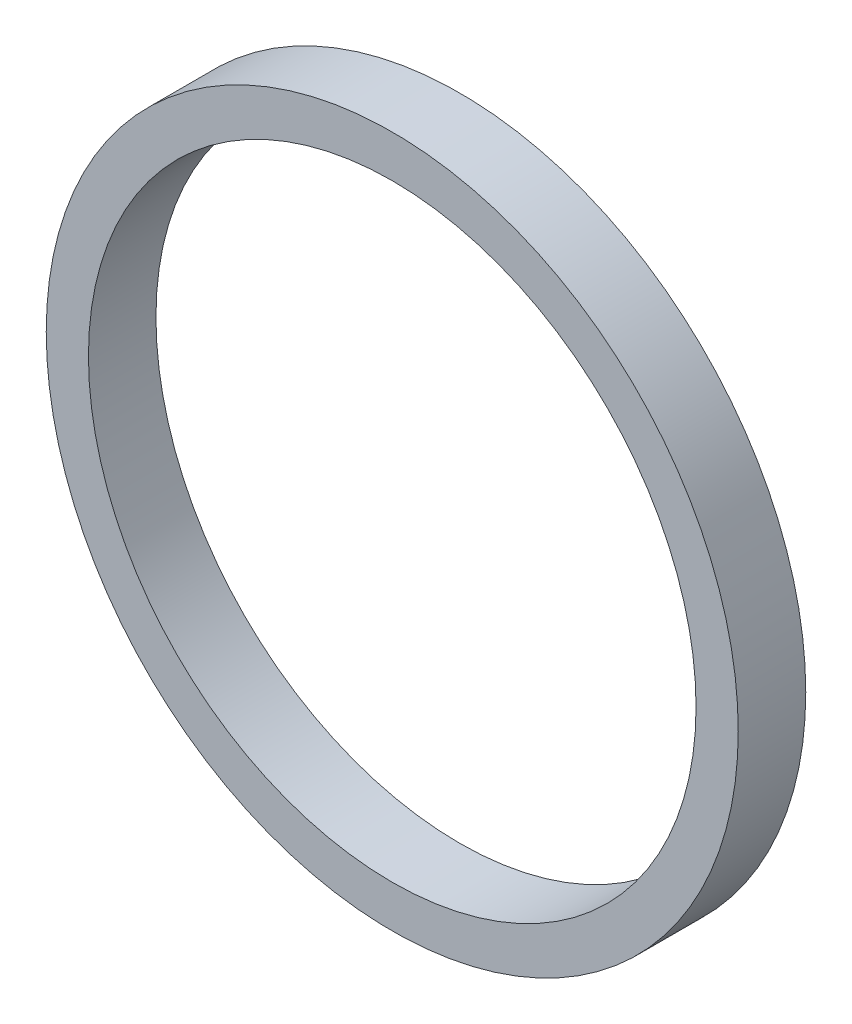
ISO-10303-21;
HEADER;
FILE_DESCRIPTION(('STEP AP214'),'2;1');
FILE_NAME('part.step','',(''),(''),'','','');
FILE_SCHEMA(('AUTOMOTIVE_DESIGN { 1 0 10303 214 1 1 1 1 }'));
ENDSEC;
DATA;
#1=APPLICATION_CONTEXT('core data for automotive mechanical design processes');
#2=APPLICATION_PROTOCOL_DEFINITION('international standard','automotive_design',2000,#1);
#3=PRODUCT_CONTEXT('',#1,'mechanical');
#4=PRODUCT('Part','Part','',(#3));
#5=PRODUCT_RELATED_PRODUCT_CATEGORY('part','',(#4));
#6=PRODUCT_DEFINITION_FORMATION('','',#4);
#7=PRODUCT_DEFINITION_CONTEXT('part definition',#1,'design');
#8=PRODUCT_DEFINITION('design','',#6,#7);
#9=PRODUCT_DEFINITION_SHAPE('','',#8);
#10=(LENGTH_UNIT() NAMED_UNIT(*) SI_UNIT(.MILLI.,.METRE.));
#11=(NAMED_UNIT(*) PLANE_ANGLE_UNIT() SI_UNIT($,.RADIAN.));
#12=(NAMED_UNIT(*) SI_UNIT($,.STERADIAN.) SOLID_ANGLE_UNIT());
#13=UNCERTAINTY_MEASURE_WITH_UNIT(LENGTH_MEASURE(1.E-05),#10,'distance_accuracy_value','');
#14=(GEOMETRIC_REPRESENTATION_CONTEXT(3) GLOBAL_UNCERTAINTY_ASSIGNED_CONTEXT((#13)) GLOBAL_UNIT_ASSIGNED_CONTEXT((#10,
#11,#12)) REPRESENTATION_CONTEXT('',''));
#15=CARTESIAN_POINT('',(0.,0.,0.));
#16=DIRECTION('',(0.,0.,1.));
#17=DIRECTION('',(1.,0.,0.));
#18=AXIS2_PLACEMENT_3D('',#15,#16,#17);
#19=CARTESIAN_POINT('',(0.,0.,-1.));
#20=DIRECTION('',(0.,0.,-1.));
#21=DIRECTION('',(1.,0.,0.));
#22=AXIS2_PLACEMENT_3D('',#19,#20,#21);
#23=CYLINDRICAL_SURFACE('',#22,18.);
#24=CARTESIAN_POINT('',(0.,0.,0.));
#25=DIRECTION('',(0.,0.,-1.));
#26=DIRECTION('',(1.,0.,0.));
#27=AXIS2_PLACEMENT_3D('',#24,#25,#26);
#28=CIRCLE('',#27,18.);
#29=CARTESIAN_POINT('',(18.,0.,0.));
#30=VERTEX_POINT('',#29);
#31=EDGE_CURVE('E61',#30,#30,#28,.T.);
#32=ORIENTED_EDGE('',*,*,#31,.T.);
#33=DIRECTION('',(0.,0.,1.));
#34=VECTOR('',#33,1.);
#35=CARTESIAN_POINT('',(18.,0.,-1.));
#36=LINE('',#35,#34);
#37=CARTESIAN_POINT('',(18.,0.,4.));
#38=VERTEX_POINT('',#37);
#39=EDGE_CURVE('E9',#30,#38,#36,.T.);
#40=ORIENTED_EDGE('',*,*,#39,.T.);
#41=CARTESIAN_POINT('',(0.,0.,4.));
#42=DIRECTION('',(0.,0.,-1.));
#43=DIRECTION('',(1.,0.,0.));
#44=AXIS2_PLACEMENT_3D('',#41,#42,#43);
#45=CIRCLE('',#44,18.);
#46=EDGE_CURVE('E18',#38,#38,#45,.T.);
#47=ORIENTED_EDGE('',*,*,#46,.F.);
#48=ORIENTED_EDGE('',*,*,#39,.F.);
#49=EDGE_LOOP('',(#32,#40,#47,#48));
#50=FACE_BOUND('',#49,.T.);
#51=ADVANCED_FACE('F15',(#50),#23,.F.);
#52=CARTESIAN_POINT('',(0.,0.,4.));
#53=DIRECTION('',(0.,0.,1.));
#54=DIRECTION('',(1.,0.,0.));
#55=AXIS2_PLACEMENT_3D('',#52,#53,#54);
#56=PLANE('',#55);
#57=ORIENTED_EDGE('',*,*,#46,.T.);
#58=EDGE_LOOP('',(#57));
#59=FACE_BOUND('',#58,.T.);
#60=CARTESIAN_POINT('',(0.,0.,4.));
#61=DIRECTION('',(0.,0.,1.));
#62=DIRECTION('',(1.,0.,0.));
#63=AXIS2_PLACEMENT_3D('',#60,#61,#62);
#64=CIRCLE('',#63,20.5);
#65=CARTESIAN_POINT('',(20.5,0.,4.));
#66=VERTEX_POINT('',#65);
#67=EDGE_CURVE('E54',#66,#66,#64,.T.);
#68=ORIENTED_EDGE('',*,*,#67,.T.);
#69=EDGE_LOOP('',(#68));
#70=FACE_BOUND('',#69,.T.);
#71=ADVANCED_FACE('F75',(#59,#70),#56,.T.);
#72=CARTESIAN_POINT('',(0.,0.,0.));
#73=DIRECTION('',(0.,0.,1.));
#74=DIRECTION('',(1.,0.,0.));
#75=AXIS2_PLACEMENT_3D('',#72,#73,#74);
#76=PLANE('',#75);
#77=ORIENTED_EDGE('',*,*,#31,.F.);
#78=EDGE_LOOP('',(#77));
#79=FACE_BOUND('',#78,.T.);
#80=CARTESIAN_POINT('',(0.,0.,0.));
#81=DIRECTION('',(0.,0.,1.));
#82=DIRECTION('',(1.,0.,0.));
#83=AXIS2_PLACEMENT_3D('',#80,#81,#82);
#84=CIRCLE('',#83,20.5);
#85=CARTESIAN_POINT('',(20.5,0.,0.));
#86=VERTEX_POINT('',#85);
#87=EDGE_CURVE('E53',#86,#86,#84,.T.);
#88=ORIENTED_EDGE('',*,*,#87,.F.);
#89=EDGE_LOOP('',(#88));
#90=FACE_BOUND('',#89,.T.);
#91=ADVANCED_FACE('F77',(#79,#90),#76,.F.);
#92=CARTESIAN_POINT('',(0.,0.,0.));
#93=DIRECTION('',(0.,0.,-1.));
#94=DIRECTION('',(1.,0.,0.));
#95=AXIS2_PLACEMENT_3D('',#92,#93,#94);
#96=CYLINDRICAL_SURFACE('',#95,20.5);
#97=ORIENTED_EDGE('',*,*,#87,.T.);
#98=DIRECTION('',(0.,0.,1.));
#99=VECTOR('',#98,1.);
#100=CARTESIAN_POINT('',(20.5,0.,0.));
#101=LINE('',#100,#99);
#102=EDGE_CURVE('E51',#86,#66,#101,.T.);
#103=ORIENTED_EDGE('',*,*,#102,.T.);
#104=ORIENTED_EDGE('',*,*,#67,.F.);
#105=ORIENTED_EDGE('',*,*,#102,.F.);
#106=EDGE_LOOP('',(#97,#103,#104,#105));
#107=FACE_BOUND('',#106,.T.);
#108=ADVANCED_FACE('F55',(#107),#96,.T.);
#109=CLOSED_SHELL('',(#51,#71,#91,#108));
#110=MANIFOLD_SOLID_BREP('B1',#109);
#111=ADVANCED_BREP_SHAPE_REPRESENTATION('',(#18,#110),#14);
#112=SHAPE_DEFINITION_REPRESENTATION(#9,#111);
ENDSEC;
END-ISO-10303-21;
